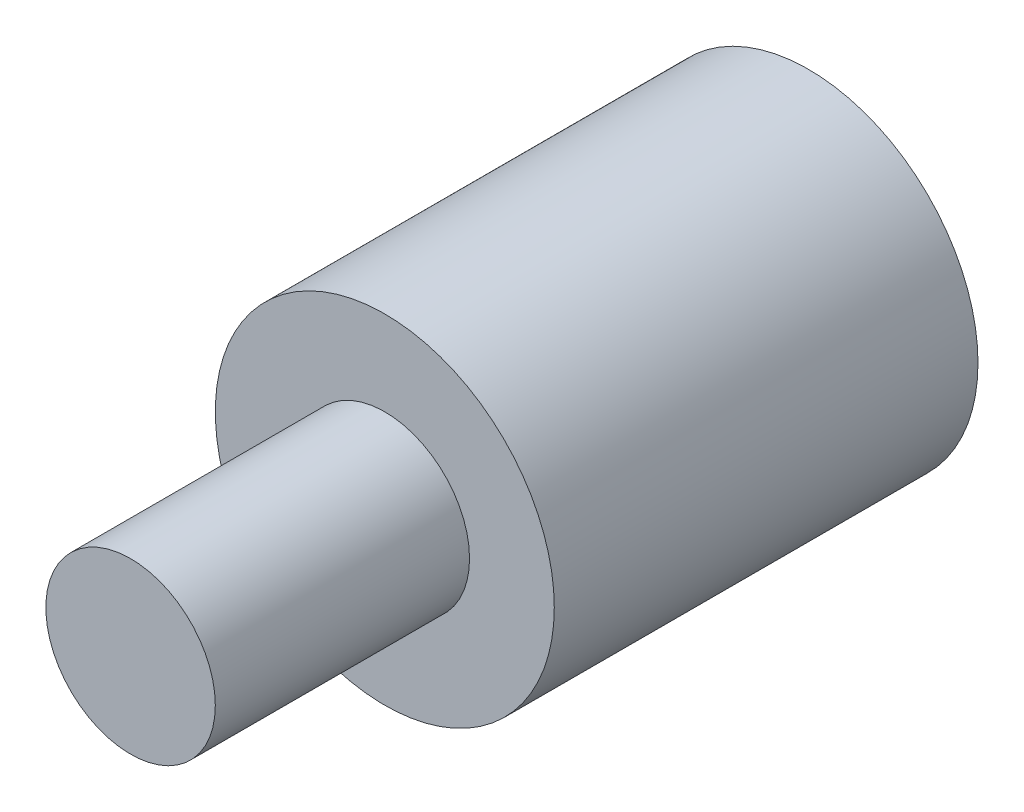
ISO-10303-21;
HEADER;
FILE_DESCRIPTION(('STEP AP214'),'2;1');
FILE_NAME('part.step','',(''),(''),'','','');
FILE_SCHEMA(('AUTOMOTIVE_DESIGN { 1 0 10303 214 1 1 1 1 }'));
ENDSEC;
DATA;
#1=APPLICATION_CONTEXT('core data for automotive mechanical design processes');
#2=APPLICATION_PROTOCOL_DEFINITION('international standard','automotive_design',2000,#1);
#3=PRODUCT_CONTEXT('',#1,'mechanical');
#4=PRODUCT('Part','Part','',(#3));
#5=PRODUCT_RELATED_PRODUCT_CATEGORY('part','',(#4));
#6=PRODUCT_DEFINITION_FORMATION('','',#4);
#7=PRODUCT_DEFINITION_CONTEXT('part definition',#1,'design');
#8=PRODUCT_DEFINITION('design','',#6,#7);
#9=PRODUCT_DEFINITION_SHAPE('','',#8);
#10=(LENGTH_UNIT() NAMED_UNIT(*) SI_UNIT(.MILLI.,.METRE.));
#11=(NAMED_UNIT(*) PLANE_ANGLE_UNIT() SI_UNIT($,.RADIAN.));
#12=(NAMED_UNIT(*) SI_UNIT($,.STERADIAN.) SOLID_ANGLE_UNIT());
#13=UNCERTAINTY_MEASURE_WITH_UNIT(LENGTH_MEASURE(1.E-05),#10,'distance_accuracy_value','');
#14=(GEOMETRIC_REPRESENTATION_CONTEXT(3) GLOBAL_UNCERTAINTY_ASSIGNED_CONTEXT((#13)) GLOBAL_UNIT_ASSIGNED_CONTEXT((#10,
#11,#12)) REPRESENTATION_CONTEXT('',''));
#15=CARTESIAN_POINT('',(0.,0.,0.));
#16=DIRECTION('',(0.,0.,1.));
#17=DIRECTION('',(1.,0.,0.));
#18=AXIS2_PLACEMENT_3D('',#15,#16,#17);
#19=CARTESIAN_POINT('',(0.,0.,50.));
#20=DIRECTION('',(0.,0.,1.));
#21=DIRECTION('',(1.,0.,0.));
#22=AXIS2_PLACEMENT_3D('',#19,#20,#21);
#23=PLANE('',#22);
#24=CARTESIAN_POINT('',(0.,0.,50.));
#25=DIRECTION('',(0.,0.,1.));
#26=DIRECTION('',(1.,0.,0.));
#27=AXIS2_PLACEMENT_3D('',#24,#25,#26);
#28=CIRCLE('',#27,20.);
#29=CARTESIAN_POINT('',(20.,0.,50.));
#30=VERTEX_POINT('',#29);
#31=EDGE_CURVE('E10',#30,#30,#28,.T.);
#32=ORIENTED_EDGE('',*,*,#31,.T.);
#33=EDGE_LOOP('',(#32));
#34=FACE_BOUND('',#33,.T.);
#35=CARTESIAN_POINT('',(0.,0.,50.));
#36=DIRECTION('',(0.,0.,1.));
#37=DIRECTION('',(1.,0.,0.));
#38=AXIS2_PLACEMENT_3D('',#35,#36,#37);
#39=CIRCLE('',#38,10.);
#40=CARTESIAN_POINT('',(10.,0.,50.));
#41=VERTEX_POINT('',#40);
#42=EDGE_CURVE('E44',#41,#41,#39,.T.);
#43=ORIENTED_EDGE('',*,*,#42,.F.);
#44=EDGE_LOOP('',(#43));
#45=FACE_BOUND('',#44,.T.);
#46=ADVANCED_FACE('F31',(#34,#45),#23,.T.);
#47=CARTESIAN_POINT('',(0.,0.,50.));
#48=DIRECTION('',(0.,0.,-1.));
#49=DIRECTION('',(-1.,0.,0.));
#50=AXIS2_PLACEMENT_3D('',#47,#48,#49);
#51=CYLINDRICAL_SURFACE('',#50,20.);
#52=ORIENTED_EDGE('',*,*,#31,.F.);
#53=EDGE_LOOP('',(#52));
#54=FACE_BOUND('',#53,.T.);
#55=CARTESIAN_POINT('',(0.,0.,0.));
#56=DIRECTION('',(0.,0.,1.));
#57=DIRECTION('',(1.,0.,0.));
#58=AXIS2_PLACEMENT_3D('',#55,#56,#57);
#59=CIRCLE('',#58,20.);
#60=CARTESIAN_POINT('',(20.,0.,0.));
#61=VERTEX_POINT('',#60);
#62=EDGE_CURVE('E35',#61,#61,#59,.T.);
#63=ORIENTED_EDGE('',*,*,#62,.T.);
#64=EDGE_LOOP('',(#63));
#65=FACE_BOUND('',#64,.T.);
#66=ADVANCED_FACE('F33',(#54,#65),#51,.T.);
#67=CARTESIAN_POINT('',(0.,0.,0.));
#68=DIRECTION('',(0.,0.,1.));
#69=DIRECTION('',(1.,0.,0.));
#70=AXIS2_PLACEMENT_3D('',#67,#68,#69);
#71=PLANE('',#70);
#72=ORIENTED_EDGE('',*,*,#62,.F.);
#73=EDGE_LOOP('',(#72));
#74=FACE_BOUND('',#73,.T.);
#75=ADVANCED_FACE('F55',(#74),#71,.F.);
#76=CARTESIAN_POINT('',(0.,0.,80.));
#77=DIRECTION('',(0.,0.,-1.));
#78=DIRECTION('',(-1.,0.,0.));
#79=AXIS2_PLACEMENT_3D('',#76,#77,#78);
#80=CYLINDRICAL_SURFACE('',#79,10.);
#81=CARTESIAN_POINT('',(0.,0.,80.));
#82=DIRECTION('',(0.,0.,1.));
#83=DIRECTION('',(1.,0.,0.));
#84=AXIS2_PLACEMENT_3D('',#81,#82,#83);
#85=CIRCLE('',#84,10.);
#86=CARTESIAN_POINT('',(10.,0.,80.));
#87=VERTEX_POINT('',#86);
#88=EDGE_CURVE('E42',#87,#87,#85,.T.);
#89=ORIENTED_EDGE('',*,*,#88,.F.);
#90=EDGE_LOOP('',(#89));
#91=FACE_BOUND('',#90,.T.);
#92=ORIENTED_EDGE('',*,*,#42,.T.);
#93=EDGE_LOOP('',(#92));
#94=FACE_BOUND('',#93,.T.);
#95=ADVANCED_FACE('F52',(#91,#94),#80,.T.);
#96=CARTESIAN_POINT('',(0.,0.,80.));
#97=DIRECTION('',(0.,0.,1.));
#98=DIRECTION('',(1.,0.,0.));
#99=AXIS2_PLACEMENT_3D('',#96,#97,#98);
#100=PLANE('',#99);
#101=ORIENTED_EDGE('',*,*,#88,.T.);
#102=EDGE_LOOP('',(#101));
#103=FACE_BOUND('',#102,.T.);
#104=ADVANCED_FACE('F50',(#103),#100,.T.);
#105=CLOSED_SHELL('',(#46,#66,#75,#95,#104));
#106=MANIFOLD_SOLID_BREP('B2',#105);
#107=ADVANCED_BREP_SHAPE_REPRESENTATION('',(#18,#106),#14);
#108=SHAPE_DEFINITION_REPRESENTATION(#9,#107);
ENDSEC;
END-ISO-10303-21;
